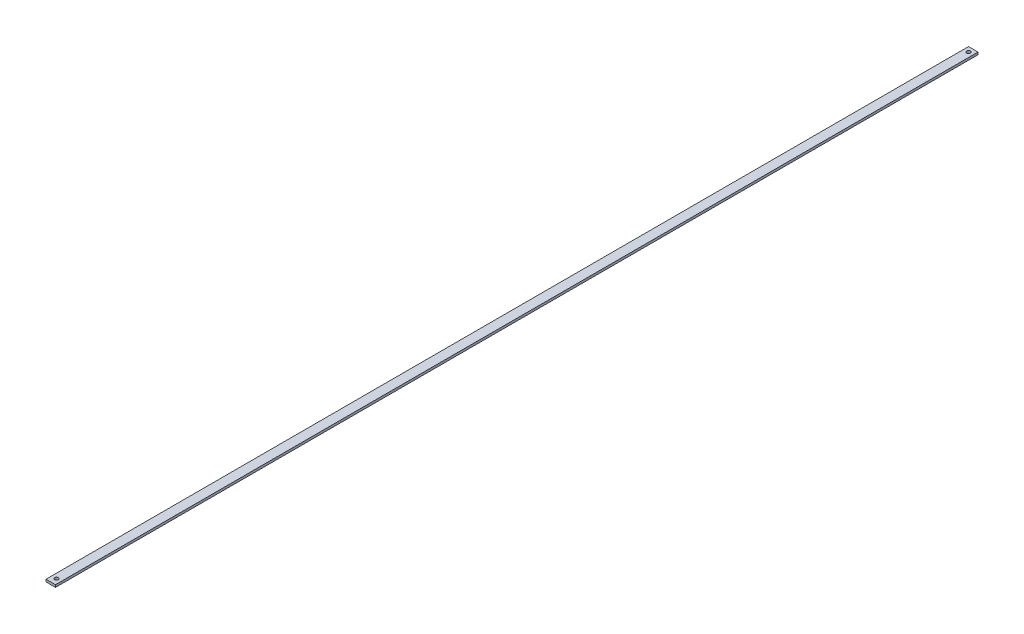
ISO-10303-21;
HEADER;
FILE_DESCRIPTION(('STEP AP214'),'2;1');
FILE_NAME('part.step','',(''),(''),'','','');
FILE_SCHEMA(('AUTOMOTIVE_DESIGN { 1 0 10303 214 1 1 1 1 }'));
ENDSEC;
DATA;
#1=APPLICATION_CONTEXT('core data for automotive mechanical design processes');
#2=APPLICATION_PROTOCOL_DEFINITION('international standard','automotive_design',2000,#1);
#3=PRODUCT_CONTEXT('',#1,'mechanical');
#4=PRODUCT('Part','Part','',(#3));
#5=PRODUCT_RELATED_PRODUCT_CATEGORY('part','',(#4));
#6=PRODUCT_DEFINITION_FORMATION('','',#4);
#7=PRODUCT_DEFINITION_CONTEXT('part definition',#1,'design');
#8=PRODUCT_DEFINITION('design','',#6,#7);
#9=PRODUCT_DEFINITION_SHAPE('','',#8);
#10=(LENGTH_UNIT() NAMED_UNIT(*) SI_UNIT(.MILLI.,.METRE.));
#11=(NAMED_UNIT(*) PLANE_ANGLE_UNIT() SI_UNIT($,.RADIAN.));
#12=(NAMED_UNIT(*) SI_UNIT($,.STERADIAN.) SOLID_ANGLE_UNIT());
#13=UNCERTAINTY_MEASURE_WITH_UNIT(LENGTH_MEASURE(1.E-05),#10,'distance_accuracy_value','');
#14=(GEOMETRIC_REPRESENTATION_CONTEXT(3) GLOBAL_UNCERTAINTY_ASSIGNED_CONTEXT((#13)) GLOBAL_UNIT_ASSIGNED_CONTEXT((#10,
#11,#12)) REPRESENTATION_CONTEXT('',''));
#15=CARTESIAN_POINT('',(0.,0.,0.));
#16=DIRECTION('',(0.,0.,1.));
#17=DIRECTION('',(1.,0.,0.));
#18=AXIS2_PLACEMENT_3D('',#15,#16,#17);
#19=CARTESIAN_POINT('',(0.,0.,2470.15));
#20=DIRECTION('',(1.,0.,0.));
#21=DIRECTION('',(0.,0.,-1.));
#22=AXIS2_PLACEMENT_3D('',#19,#20,#21);
#23=PLANE('',#22);
#24=DIRECTION('',(0.,-1.,0.));
#25=VECTOR('',#24,1.);
#26=CARTESIAN_POINT('',(0.,0.,0.));
#27=LINE('',#26,#25);
#28=CARTESIAN_POINT('',(0.,6.35,0.));
#29=VERTEX_POINT('',#28);
#30=CARTESIAN_POINT('',(0.,0.,0.));
#31=VERTEX_POINT('',#30);
#32=EDGE_CURVE('E98',#29,#31,#27,.T.);
#33=ORIENTED_EDGE('',*,*,#32,.T.);
#34=DIRECTION('',(0.,0.,-1.));
#35=VECTOR('',#34,1.);
#36=CARTESIAN_POINT('',(0.,0.,2470.15));
#37=LINE('',#36,#35);
#38=CARTESIAN_POINT('',(0.,0.,2470.15));
#39=VERTEX_POINT('',#38);
#40=EDGE_CURVE('E11',#39,#31,#37,.T.);
#41=ORIENTED_EDGE('',*,*,#40,.F.);
#42=DIRECTION('',(0.,-1.,0.));
#43=VECTOR('',#42,1.);
#44=CARTESIAN_POINT('',(0.,0.,2470.15));
#45=LINE('',#44,#43);
#46=CARTESIAN_POINT('',(0.,6.35,2470.15));
#47=VERTEX_POINT('',#46);
#48=EDGE_CURVE('E86',#47,#39,#45,.T.);
#49=ORIENTED_EDGE('',*,*,#48,.F.);
#50=DIRECTION('',(0.,0.,-1.));
#51=VECTOR('',#50,1.);
#52=CARTESIAN_POINT('',(0.,6.35,2470.15));
#53=LINE('',#52,#51);
#54=EDGE_CURVE('E94',#47,#29,#53,.T.);
#55=ORIENTED_EDGE('',*,*,#54,.T.);
#56=EDGE_LOOP('',(#33,#41,#49,#55));
#57=FACE_BOUND('',#56,.T.);
#58=ADVANCED_FACE('F35',(#57),#23,.F.);
#59=CARTESIAN_POINT('',(0.,0.,2470.15));
#60=DIRECTION('',(0.,1.,0.));
#61=DIRECTION('',(0.,0.,1.));
#62=AXIS2_PLACEMENT_3D('',#59,#60,#61);
#63=PLANE('',#62);
#64=CARTESIAN_POINT('',(12.7,0.,2454.75149012081));
#65=DIRECTION('',(0.,-1.,0.));
#66=DIRECTION('',(0.,0.,-1.));
#67=AXIS2_PLACEMENT_3D('',#64,#65,#66);
#68=CIRCLE('',#67,5.04189999999999);
#69=CARTESIAN_POINT('',(12.7,0.,2449.70959012081));
#70=VERTEX_POINT('',#69);
#71=EDGE_CURVE('E120',#70,#70,#68,.T.);
#72=ORIENTED_EDGE('',*,*,#71,.F.);
#73=EDGE_LOOP('',(#72));
#74=FACE_BOUND('',#73,.T.);
#75=CARTESIAN_POINT('',(12.7,0.,12.7));
#76=DIRECTION('',(0.,1.,0.));
#77=DIRECTION('',(0.,0.,1.));
#78=AXIS2_PLACEMENT_3D('',#75,#76,#77);
#79=CIRCLE('',#78,5.04189999999999);
#80=CARTESIAN_POINT('',(12.7,0.,17.7419));
#81=VERTEX_POINT('',#80);
#82=EDGE_CURVE('E101',#81,#81,#79,.T.);
#83=ORIENTED_EDGE('',*,*,#82,.T.);
#84=EDGE_LOOP('',(#83));
#85=FACE_BOUND('',#84,.T.);
#86=DIRECTION('',(1.,0.,0.));
#87=VECTOR('',#86,1.);
#88=CARTESIAN_POINT('',(0.,0.,0.));
#89=LINE('',#88,#87);
#90=CARTESIAN_POINT('',(25.4,0.,0.));
#91=VERTEX_POINT('',#90);
#92=EDGE_CURVE('E90',#31,#91,#89,.T.);
#93=ORIENTED_EDGE('',*,*,#92,.T.);
#94=DIRECTION('',(0.,0.,-1.));
#95=VECTOR('',#94,1.);
#96=CARTESIAN_POINT('',(25.4,0.,2470.15));
#97=LINE('',#96,#95);
#98=CARTESIAN_POINT('',(25.4,0.,2470.15));
#99=VERTEX_POINT('',#98);
#100=EDGE_CURVE('E43',#99,#91,#97,.T.);
#101=ORIENTED_EDGE('',*,*,#100,.F.);
#102=DIRECTION('',(1.,0.,0.));
#103=VECTOR('',#102,1.);
#104=CARTESIAN_POINT('',(0.,0.,2470.15));
#105=LINE('',#104,#103);
#106=EDGE_CURVE('E81',#39,#99,#105,.T.);
#107=ORIENTED_EDGE('',*,*,#106,.F.);
#108=ORIENTED_EDGE('',*,*,#40,.T.);
#109=EDGE_LOOP('',(#93,#101,#107,#108));
#110=FACE_BOUND('',#109,.T.);
#111=ADVANCED_FACE('F89',(#74,#85,#110),#63,.F.);
#112=CARTESIAN_POINT('',(25.4,0.,2470.15));
#113=DIRECTION('',(-1.,0.,0.));
#114=DIRECTION('',(0.,0.,1.));
#115=AXIS2_PLACEMENT_3D('',#112,#113,#114);
#116=PLANE('',#115);
#117=DIRECTION('',(0.,1.,0.));
#118=VECTOR('',#117,1.);
#119=CARTESIAN_POINT('',(25.4,0.,0.));
#120=LINE('',#119,#118);
#121=CARTESIAN_POINT('',(25.4,6.35,0.));
#122=VERTEX_POINT('',#121);
#123=EDGE_CURVE('E68',#91,#122,#120,.T.);
#124=ORIENTED_EDGE('',*,*,#123,.T.);
#125=DIRECTION('',(0.,0.,-1.));
#126=VECTOR('',#125,1.);
#127=CARTESIAN_POINT('',(25.4,6.35,2470.15));
#128=LINE('',#127,#126);
#129=CARTESIAN_POINT('',(25.4,6.35,2470.15));
#130=VERTEX_POINT('',#129);
#131=EDGE_CURVE('E91',#130,#122,#128,.T.);
#132=ORIENTED_EDGE('',*,*,#131,.F.);
#133=DIRECTION('',(0.,1.,0.));
#134=VECTOR('',#133,1.);
#135=CARTESIAN_POINT('',(25.4,0.,2470.15));
#136=LINE('',#135,#134);
#137=EDGE_CURVE('E84',#99,#130,#136,.T.);
#138=ORIENTED_EDGE('',*,*,#137,.F.);
#139=ORIENTED_EDGE('',*,*,#100,.T.);
#140=EDGE_LOOP('',(#124,#132,#138,#139));
#141=FACE_BOUND('',#140,.T.);
#142=ADVANCED_FACE('F92',(#141),#116,.F.);
#143=CARTESIAN_POINT('',(0.,6.35,2470.15));
#144=DIRECTION('',(0.,-1.,0.));
#145=DIRECTION('',(0.,0.,-1.));
#146=AXIS2_PLACEMENT_3D('',#143,#144,#145);
#147=PLANE('',#146);
#148=CARTESIAN_POINT('',(12.7,6.35,2454.75149012081));
#149=DIRECTION('',(0.,-1.,0.));
#150=DIRECTION('',(0.,0.,-1.));
#151=AXIS2_PLACEMENT_3D('',#148,#149,#150);
#152=CIRCLE('',#151,5.0419);
#153=CARTESIAN_POINT('',(12.7,6.35,2449.70959012081));
#154=VERTEX_POINT('',#153);
#155=EDGE_CURVE('E117',#154,#154,#152,.T.);
#156=ORIENTED_EDGE('',*,*,#155,.T.);
#157=EDGE_LOOP('',(#156));
#158=FACE_BOUND('',#157,.T.);
#159=CARTESIAN_POINT('',(12.7,6.35,12.7));
#160=DIRECTION('',(0.,1.,0.));
#161=DIRECTION('',(0.,0.,1.));
#162=AXIS2_PLACEMENT_3D('',#159,#160,#161);
#163=CIRCLE('',#162,5.04189999999999);
#164=CARTESIAN_POINT('',(12.7,6.35,17.7419));
#165=VERTEX_POINT('',#164);
#166=EDGE_CURVE('E114',#165,#165,#163,.T.);
#167=ORIENTED_EDGE('',*,*,#166,.F.);
#168=EDGE_LOOP('',(#167));
#169=FACE_BOUND('',#168,.T.);
#170=DIRECTION('',(-1.,0.,0.));
#171=VECTOR('',#170,1.);
#172=CARTESIAN_POINT('',(0.,6.35,0.));
#173=LINE('',#172,#171);
#174=EDGE_CURVE('E74',#122,#29,#173,.T.);
#175=ORIENTED_EDGE('',*,*,#174,.T.);
#176=ORIENTED_EDGE('',*,*,#54,.F.);
#177=DIRECTION('',(-1.,0.,0.));
#178=VECTOR('',#177,1.);
#179=CARTESIAN_POINT('',(0.,6.35,2470.15));
#180=LINE('',#179,#178);
#181=EDGE_CURVE('E51',#130,#47,#180,.T.);
#182=ORIENTED_EDGE('',*,*,#181,.F.);
#183=ORIENTED_EDGE('',*,*,#131,.T.);
#184=EDGE_LOOP('',(#175,#176,#182,#183));
#185=FACE_BOUND('',#184,.T.);
#186=ADVANCED_FACE('F106',(#158,#169,#185),#147,.F.);
#187=CARTESIAN_POINT('',(0.,0.,2470.15));
#188=DIRECTION('',(0.,0.,-1.));
#189=DIRECTION('',(-1.,0.,0.));
#190=AXIS2_PLACEMENT_3D('',#187,#188,#189);
#191=PLANE('',#190);
#192=ORIENTED_EDGE('',*,*,#48,.T.);
#193=ORIENTED_EDGE('',*,*,#106,.T.);
#194=ORIENTED_EDGE('',*,*,#137,.T.);
#195=ORIENTED_EDGE('',*,*,#181,.T.);
#196=EDGE_LOOP('',(#192,#193,#194,#195));
#197=FACE_BOUND('',#196,.T.);
#198=ADVANCED_FACE('F82',(#197),#191,.F.);
#199=CARTESIAN_POINT('',(0.,0.,0.));
#200=DIRECTION('',(0.,0.,-1.));
#201=DIRECTION('',(-1.,0.,0.));
#202=AXIS2_PLACEMENT_3D('',#199,#200,#201);
#203=PLANE('',#202);
#204=ORIENTED_EDGE('',*,*,#32,.F.);
#205=ORIENTED_EDGE('',*,*,#174,.F.);
#206=ORIENTED_EDGE('',*,*,#123,.F.);
#207=ORIENTED_EDGE('',*,*,#92,.F.);
#208=EDGE_LOOP('',(#204,#205,#206,#207));
#209=FACE_BOUND('',#208,.T.);
#210=ADVANCED_FACE('F109',(#209),#203,.T.);
#211=CARTESIAN_POINT('',(12.7,6.35,12.7));
#212=DIRECTION('',(0.,1.,0.));
#213=DIRECTION('',(0.,0.,1.));
#214=AXIS2_PLACEMENT_3D('',#211,#212,#213);
#215=CYLINDRICAL_SURFACE('',#214,5.04189999999999);
#216=ORIENTED_EDGE('',*,*,#82,.F.);
#217=EDGE_LOOP('',(#216));
#218=FACE_BOUND('',#217,.T.);
#219=ORIENTED_EDGE('',*,*,#166,.T.);
#220=EDGE_LOOP('',(#219));
#221=FACE_BOUND('',#220,.T.);
#222=ADVANCED_FACE('F130',(#218,#221),#215,.F.);
#223=CARTESIAN_POINT('',(12.7,0.,2454.75149012081));
#224=DIRECTION('',(0.,-1.,0.));
#225=DIRECTION('',(0.,0.,-1.));
#226=AXIS2_PLACEMENT_3D('',#223,#224,#225);
#227=CYLINDRICAL_SURFACE('',#226,5.04189999999999);
#228=ORIENTED_EDGE('',*,*,#155,.F.);
#229=EDGE_LOOP('',(#228));
#230=FACE_BOUND('',#229,.T.);
#231=ORIENTED_EDGE('',*,*,#71,.T.);
#232=EDGE_LOOP('',(#231));
#233=FACE_BOUND('',#232,.T.);
#234=ADVANCED_FACE('F124',(#230,#233),#227,.F.);
#235=CLOSED_SHELL('',(#58,#111,#142,#186,#198,#210,#222,#234));
#236=MANIFOLD_SOLID_BREP('B2',#235);
#237=ADVANCED_BREP_SHAPE_REPRESENTATION('',(#18,#236),#14);
#238=SHAPE_DEFINITION_REPRESENTATION(#9,#237);
ENDSEC;
END-ISO-10303-21;
